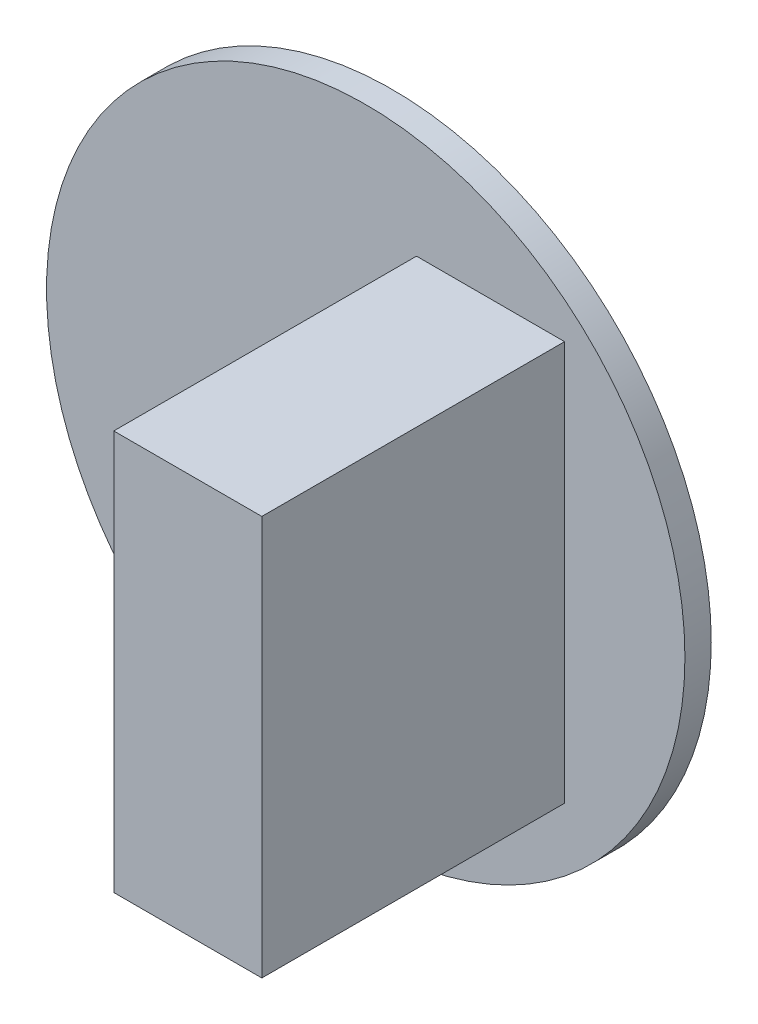
ISO-10303-21;
HEADER;
FILE_DESCRIPTION(('STEP AP214'),'2;1');
FILE_NAME('part.step','',(''),(''),'','','');
FILE_SCHEMA(('AUTOMOTIVE_DESIGN { 1 0 10303 214 1 1 1 1 }'));
ENDSEC;
DATA;
#1=APPLICATION_CONTEXT('core data for automotive mechanical design processes');
#2=APPLICATION_PROTOCOL_DEFINITION('international standard','automotive_design',2000,#1);
#3=PRODUCT_CONTEXT('',#1,'mechanical');
#4=PRODUCT('Part','Part','',(#3));
#5=PRODUCT_RELATED_PRODUCT_CATEGORY('part','',(#4));
#6=PRODUCT_DEFINITION_FORMATION('','',#4);
#7=PRODUCT_DEFINITION_CONTEXT('part definition',#1,'design');
#8=PRODUCT_DEFINITION('design','',#6,#7);
#9=PRODUCT_DEFINITION_SHAPE('','',#8);
#10=(LENGTH_UNIT() NAMED_UNIT(*) SI_UNIT(.MILLI.,.METRE.));
#11=(NAMED_UNIT(*) PLANE_ANGLE_UNIT() SI_UNIT($,.RADIAN.));
#12=(NAMED_UNIT(*) SI_UNIT($,.STERADIAN.) SOLID_ANGLE_UNIT());
#13=UNCERTAINTY_MEASURE_WITH_UNIT(LENGTH_MEASURE(1.E-05),#10,'distance_accuracy_value','');
#14=(GEOMETRIC_REPRESENTATION_CONTEXT(3) GLOBAL_UNCERTAINTY_ASSIGNED_CONTEXT((#13)) GLOBAL_UNIT_ASSIGNED_CONTEXT((#10,
#11,#12)) REPRESENTATION_CONTEXT('',''));
#15=CARTESIAN_POINT('',(0.,0.,0.));
#16=DIRECTION('',(0.,0.,1.));
#17=DIRECTION('',(1.,0.,0.));
#18=AXIS2_PLACEMENT_3D('',#15,#16,#17);
#19=CARTESIAN_POINT('',(0.,0.,4.));
#20=DIRECTION('',(0.,0.,1.));
#21=DIRECTION('',(1.,0.,0.));
#22=AXIS2_PLACEMENT_3D('',#19,#20,#21);
#23=PLANE('',#22);
#24=CARTESIAN_POINT('',(0.,0.,4.));
#25=DIRECTION('',(0.,0.,1.));
#26=DIRECTION('',(1.,0.,0.));
#27=AXIS2_PLACEMENT_3D('',#24,#25,#26);
#28=CIRCLE('',#27,48.5);
#29=CARTESIAN_POINT('',(48.5,0.,4.));
#30=VERTEX_POINT('',#29);
#31=EDGE_CURVE('E11',#30,#30,#28,.T.);
#32=ORIENTED_EDGE('',*,*,#31,.T.);
#33=EDGE_LOOP('',(#32));
#34=FACE_BOUND('',#33,.T.);
#35=DIRECTION('',(-1.,0.,0.));
#36=VECTOR('',#35,1.);
#37=CARTESIAN_POINT('',(0.,-28.3397123921525,4.));
#38=LINE('',#37,#36);
#39=CARTESIAN_POINT('',(30.2105661401083,-28.3397123921525,4.));
#40=VERTEX_POINT('',#39);
#41=CARTESIAN_POINT('',(7.71056614010832,-28.3397123921525,4.));
#42=VERTEX_POINT('',#41);
#43=EDGE_CURVE('E112',#40,#42,#38,.T.);
#44=ORIENTED_EDGE('',*,*,#43,.T.);
#45=DIRECTION('',(0.,1.,0.));
#46=VECTOR('',#45,1.);
#47=CARTESIAN_POINT('',(7.71056614010832,0.,4.));
#48=LINE('',#47,#46);
#49=CARTESIAN_POINT('',(7.71056614010832,32.3979050974727,4.));
#50=VERTEX_POINT('',#49);
#51=EDGE_CURVE('E64',#42,#50,#48,.T.);
#52=ORIENTED_EDGE('',*,*,#51,.T.);
#53=DIRECTION('',(1.,0.,0.));
#54=VECTOR('',#53,1.);
#55=CARTESIAN_POINT('',(0.,32.3979050974727,4.));
#56=LINE('',#55,#54);
#57=CARTESIAN_POINT('',(30.2105661401083,32.3979050974727,4.));
#58=VERTEX_POINT('',#57);
#59=EDGE_CURVE('E102',#50,#58,#56,.T.);
#60=ORIENTED_EDGE('',*,*,#59,.T.);
#61=DIRECTION('',(0.,-1.,0.));
#62=VECTOR('',#61,1.);
#63=CARTESIAN_POINT('',(30.2105661401083,0.,4.));
#64=LINE('',#63,#62);
#65=EDGE_CURVE('E105',#58,#40,#64,.T.);
#66=ORIENTED_EDGE('',*,*,#65,.T.);
#67=EDGE_LOOP('',(#44,#52,#60,#66));
#68=FACE_BOUND('',#67,.T.);
#69=ADVANCED_FACE('F41',(#34,#68),#23,.T.);
#70=CARTESIAN_POINT('',(0.,0.,4.));
#71=DIRECTION('',(0.,0.,-1.));
#72=DIRECTION('',(-1.,0.,0.));
#73=AXIS2_PLACEMENT_3D('',#70,#71,#72);
#74=CYLINDRICAL_SURFACE('',#73,48.5);
#75=ORIENTED_EDGE('',*,*,#31,.F.);
#76=EDGE_LOOP('',(#75));
#77=FACE_BOUND('',#76,.T.);
#78=CARTESIAN_POINT('',(0.,0.,0.));
#79=DIRECTION('',(0.,0.,1.));
#80=DIRECTION('',(1.,0.,0.));
#81=AXIS2_PLACEMENT_3D('',#78,#79,#80);
#82=CIRCLE('',#81,48.5);
#83=CARTESIAN_POINT('',(48.5,0.,0.));
#84=VERTEX_POINT('',#83);
#85=EDGE_CURVE('E45',#84,#84,#82,.T.);
#86=ORIENTED_EDGE('',*,*,#85,.T.);
#87=EDGE_LOOP('',(#86));
#88=FACE_BOUND('',#87,.T.);
#89=ADVANCED_FACE('F43',(#77,#88),#74,.T.);
#90=CARTESIAN_POINT('',(0.,0.,0.));
#91=DIRECTION('',(0.,0.,1.));
#92=DIRECTION('',(1.,0.,0.));
#93=AXIS2_PLACEMENT_3D('',#90,#91,#92);
#94=PLANE('',#93);
#95=ORIENTED_EDGE('',*,*,#85,.F.);
#96=EDGE_LOOP('',(#95));
#97=FACE_BOUND('',#96,.T.);
#98=ADVANCED_FACE('F119',(#97),#94,.F.);
#99=CARTESIAN_POINT('',(7.71056614010832,32.3979050974727,50.));
#100=DIRECTION('',(1.,0.,0.));
#101=DIRECTION('',(0.,0.,-1.));
#102=AXIS2_PLACEMENT_3D('',#99,#100,#101);
#103=PLANE('',#102);
#104=ORIENTED_EDGE('',*,*,#51,.F.);
#105=DIRECTION('',(0.,0.,-1.));
#106=VECTOR('',#105,1.);
#107=CARTESIAN_POINT('',(7.71056614010832,-28.3397123921525,50.));
#108=LINE('',#107,#106);
#109=CARTESIAN_POINT('',(7.71056614010832,-28.3397123921525,50.));
#110=VERTEX_POINT('',#109);
#111=EDGE_CURVE('E87',#110,#42,#108,.T.);
#112=ORIENTED_EDGE('',*,*,#111,.F.);
#113=DIRECTION('',(0.,-1.,0.));
#114=VECTOR('',#113,1.);
#115=CARTESIAN_POINT('',(7.71056614010832,32.3979050974727,50.));
#116=LINE('',#115,#114);
#117=CARTESIAN_POINT('',(7.71056614010832,32.3979050974727,50.));
#118=VERTEX_POINT('',#117);
#119=EDGE_CURVE('E94',#118,#110,#116,.T.);
#120=ORIENTED_EDGE('',*,*,#119,.F.);
#121=DIRECTION('',(0.,0.,-1.));
#122=VECTOR('',#121,1.);
#123=CARTESIAN_POINT('',(7.71056614010832,32.3979050974727,50.));
#124=LINE('',#123,#122);
#125=EDGE_CURVE('E203',#118,#50,#124,.T.);
#126=ORIENTED_EDGE('',*,*,#125,.T.);
#127=EDGE_LOOP('',(#104,#112,#120,#126));
#128=FACE_BOUND('',#127,.T.);
#129=ADVANCED_FACE('F101',(#128),#103,.F.);
#130=CARTESIAN_POINT('',(7.71056614010832,-28.3397123921525,50.));
#131=DIRECTION('',(0.,1.,0.));
#132=DIRECTION('',(0.,0.,1.));
#133=AXIS2_PLACEMENT_3D('',#130,#131,#132);
#134=PLANE('',#133);
#135=ORIENTED_EDGE('',*,*,#43,.F.);
#136=DIRECTION('',(0.,0.,-1.));
#137=VECTOR('',#136,1.);
#138=CARTESIAN_POINT('',(30.2105661401083,-28.3397123921525,50.));
#139=LINE('',#138,#137);
#140=CARTESIAN_POINT('',(30.2105661401083,-28.3397123921525,50.));
#141=VERTEX_POINT('',#140);
#142=EDGE_CURVE('E90',#141,#40,#139,.T.);
#143=ORIENTED_EDGE('',*,*,#142,.F.);
#144=DIRECTION('',(1.,0.,0.));
#145=VECTOR('',#144,1.);
#146=CARTESIAN_POINT('',(7.71056614010832,-28.3397123921525,50.));
#147=LINE('',#146,#145);
#148=EDGE_CURVE('E84',#110,#141,#147,.T.);
#149=ORIENTED_EDGE('',*,*,#148,.F.);
#150=ORIENTED_EDGE('',*,*,#111,.T.);
#151=EDGE_LOOP('',(#135,#143,#149,#150));
#152=FACE_BOUND('',#151,.T.);
#153=ADVANCED_FACE('F86',(#152),#134,.F.);
#154=CARTESIAN_POINT('',(30.2105661401083,32.3979050974727,50.));
#155=DIRECTION('',(-1.,0.,0.));
#156=DIRECTION('',(0.,-1.,0.));
#157=AXIS2_PLACEMENT_3D('',#154,#155,#156);
#158=PLANE('',#157);
#159=ORIENTED_EDGE('',*,*,#65,.F.);
#160=DIRECTION('',(0.,0.,-1.));
#161=VECTOR('',#160,1.);
#162=CARTESIAN_POINT('',(30.2105661401083,32.3979050974727,50.));
#163=LINE('',#162,#161);
#164=CARTESIAN_POINT('',(30.2105661401083,32.3979050974727,50.));
#165=VERTEX_POINT('',#164);
#166=EDGE_CURVE('E56',#165,#58,#163,.T.);
#167=ORIENTED_EDGE('',*,*,#166,.F.);
#168=DIRECTION('',(0.,1.,0.));
#169=VECTOR('',#168,1.);
#170=CARTESIAN_POINT('',(30.2105661401083,32.3979050974727,50.));
#171=LINE('',#170,#169);
#172=EDGE_CURVE('E93',#141,#165,#171,.T.);
#173=ORIENTED_EDGE('',*,*,#172,.F.);
#174=ORIENTED_EDGE('',*,*,#142,.T.);
#175=EDGE_LOOP('',(#159,#167,#173,#174));
#176=FACE_BOUND('',#175,.T.);
#177=ADVANCED_FACE('F135',(#176),#158,.F.);
#178=CARTESIAN_POINT('',(7.71056614010832,32.3979050974727,50.));
#179=DIRECTION('',(0.,-1.,0.));
#180=DIRECTION('',(0.,0.,-1.));
#181=AXIS2_PLACEMENT_3D('',#178,#179,#180);
#182=PLANE('',#181);
#183=ORIENTED_EDGE('',*,*,#59,.F.);
#184=ORIENTED_EDGE('',*,*,#125,.F.);
#185=DIRECTION('',(-1.,0.,0.));
#186=VECTOR('',#185,1.);
#187=CARTESIAN_POINT('',(7.71056614010832,32.3979050974727,50.));
#188=LINE('',#187,#186);
#189=EDGE_CURVE('E98',#165,#118,#188,.T.);
#190=ORIENTED_EDGE('',*,*,#189,.F.);
#191=ORIENTED_EDGE('',*,*,#166,.T.);
#192=EDGE_LOOP('',(#183,#184,#190,#191));
#193=FACE_BOUND('',#192,.T.);
#194=ADVANCED_FACE('F138',(#193),#182,.F.);
#195=CARTESIAN_POINT('',(0.,0.,50.));
#196=DIRECTION('',(0.,0.,1.));
#197=DIRECTION('',(1.,0.,0.));
#198=AXIS2_PLACEMENT_3D('',#195,#196,#197);
#199=PLANE('',#198);
#200=ORIENTED_EDGE('',*,*,#119,.T.);
#201=ORIENTED_EDGE('',*,*,#148,.T.);
#202=ORIENTED_EDGE('',*,*,#172,.T.);
#203=ORIENTED_EDGE('',*,*,#189,.T.);
#204=EDGE_LOOP('',(#200,#201,#202,#203));
#205=FACE_BOUND('',#204,.T.);
#206=ADVANCED_FACE('F97',(#205),#199,.T.);
#207=CLOSED_SHELL('',(#69,#89,#98,#129,#153,#177,#194,#206));
#208=MANIFOLD_SOLID_BREP('B2',#207);
#209=ADVANCED_BREP_SHAPE_REPRESENTATION('',(#18,#208),#14);
#210=SHAPE_DEFINITION_REPRESENTATION(#9,#209);
ENDSEC;
END-ISO-10303-21;
